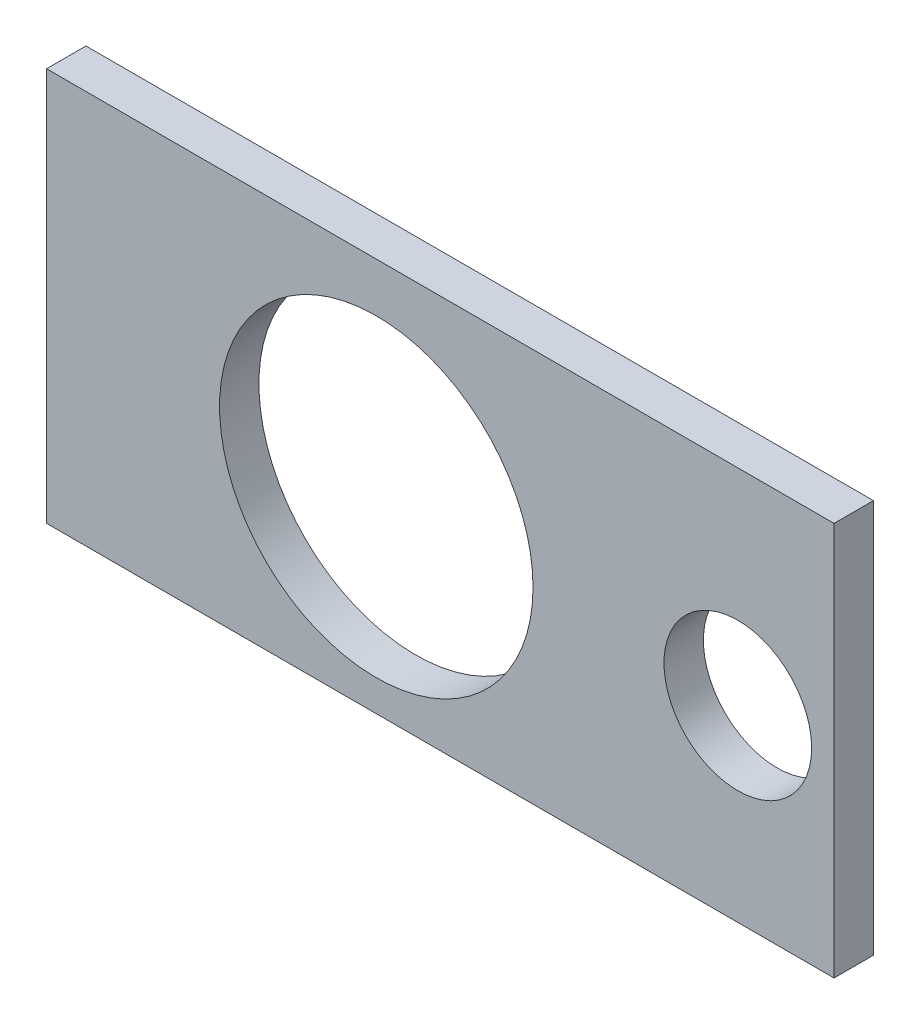
ISO-10303-21;
HEADER;
FILE_DESCRIPTION(('STEP AP214'),'2;1');
FILE_NAME('part.step','',(''),(''),'','','');
FILE_SCHEMA(('AUTOMOTIVE_DESIGN { 1 0 10303 214 1 1 1 1 }'));
ENDSEC;
DATA;
#1=APPLICATION_CONTEXT('core data for automotive mechanical design processes');
#2=APPLICATION_PROTOCOL_DEFINITION('international standard','automotive_design',2000,#1);
#3=PRODUCT_CONTEXT('',#1,'mechanical');
#4=PRODUCT('Part','Part','',(#3));
#5=PRODUCT_RELATED_PRODUCT_CATEGORY('part','',(#4));
#6=PRODUCT_DEFINITION_FORMATION('','',#4);
#7=PRODUCT_DEFINITION_CONTEXT('part definition',#1,'design');
#8=PRODUCT_DEFINITION('design','',#6,#7);
#9=PRODUCT_DEFINITION_SHAPE('','',#8);
#10=(LENGTH_UNIT() NAMED_UNIT(*) SI_UNIT(.MILLI.,.METRE.));
#11=(NAMED_UNIT(*) PLANE_ANGLE_UNIT() SI_UNIT($,.RADIAN.));
#12=(NAMED_UNIT(*) SI_UNIT($,.STERADIAN.) SOLID_ANGLE_UNIT());
#13=UNCERTAINTY_MEASURE_WITH_UNIT(LENGTH_MEASURE(1.E-05),#10,'distance_accuracy_value','');
#14=(GEOMETRIC_REPRESENTATION_CONTEXT(3) GLOBAL_UNCERTAINTY_ASSIGNED_CONTEXT((#13)) GLOBAL_UNIT_ASSIGNED_CONTEXT((#10,
#11,#12)) REPRESENTATION_CONTEXT('',''));
#15=CARTESIAN_POINT('',(0.,0.,0.));
#16=DIRECTION('',(0.,0.,1.));
#17=DIRECTION('',(1.,0.,0.));
#18=AXIS2_PLACEMENT_3D('',#15,#16,#17);
#19=CARTESIAN_POINT('',(19.7739413680782,0.,-2.54));
#20=DIRECTION('',(-1.,0.,0.));
#21=DIRECTION('',(0.,-1.,0.));
#22=AXIS2_PLACEMENT_3D('',#19,#20,#21);
#23=PLANE('',#22);
#24=DIRECTION('',(0.,-1.,0.));
#25=VECTOR('',#24,1.);
#26=CARTESIAN_POINT('',(19.7739413680782,0.,0.));
#27=LINE('',#26,#25);
#28=CARTESIAN_POINT('',(19.7739413680782,13.2791530944625,0.));
#29=VERTEX_POINT('',#28);
#30=CARTESIAN_POINT('',(19.7739413680782,-12.1208469055375,0.));
#31=VERTEX_POINT('',#30);
#32=EDGE_CURVE('E117',#29,#31,#27,.T.);
#33=ORIENTED_EDGE('',*,*,#32,.T.);
#34=DIRECTION('',(0.,0.,1.));
#35=VECTOR('',#34,1.);
#36=CARTESIAN_POINT('',(19.7739413680782,-12.1208469055375,-2.54));
#37=LINE('',#36,#35);
#38=CARTESIAN_POINT('',(19.7739413680782,-12.1208469055375,-2.54));
#39=VERTEX_POINT('',#38);
#40=EDGE_CURVE('E11',#39,#31,#37,.T.);
#41=ORIENTED_EDGE('',*,*,#40,.F.);
#42=DIRECTION('',(0.,-1.,0.));
#43=VECTOR('',#42,1.);
#44=CARTESIAN_POINT('',(19.7739413680782,0.,-2.54));
#45=LINE('',#44,#43);
#46=CARTESIAN_POINT('',(19.7739413680782,13.2791530944625,-2.54));
#47=VERTEX_POINT('',#46);
#48=EDGE_CURVE('E61',#47,#39,#45,.T.);
#49=ORIENTED_EDGE('',*,*,#48,.F.);
#50=DIRECTION('',(0.,0.,1.));
#51=VECTOR('',#50,1.);
#52=CARTESIAN_POINT('',(19.7739413680782,13.2791530944625,-2.54));
#53=LINE('',#52,#51);
#54=EDGE_CURVE('E45',#47,#29,#53,.T.);
#55=ORIENTED_EDGE('',*,*,#54,.T.);
#56=EDGE_LOOP('',(#33,#41,#49,#55));
#57=FACE_BOUND('',#56,.T.);
#58=ADVANCED_FACE('F41',(#57),#23,.F.);
#59=CARTESIAN_POINT('',(0.,-12.1208469055375,-2.54));
#60=DIRECTION('',(0.,-1.,0.));
#61=DIRECTION('',(0.,0.,-1.));
#62=AXIS2_PLACEMENT_3D('',#59,#60,#61);
#63=PLANE('',#62);
#64=DIRECTION('',(1.,0.,0.));
#65=VECTOR('',#64,1.);
#66=CARTESIAN_POINT('',(0.,-12.1208469055375,0.));
#67=LINE('',#66,#65);
#68=CARTESIAN_POINT('',(-31.0260586319218,-12.1208469055375,0.));
#69=VERTEX_POINT('',#68);
#70=EDGE_CURVE('E125',#69,#31,#67,.T.);
#71=ORIENTED_EDGE('',*,*,#70,.F.);
#72=DIRECTION('',(0.,0.,1.));
#73=VECTOR('',#72,1.);
#74=CARTESIAN_POINT('',(-31.0260586319218,-12.1208469055375,-2.54));
#75=LINE('',#74,#73);
#76=CARTESIAN_POINT('',(-31.0260586319218,-12.1208469055375,-2.54));
#77=VERTEX_POINT('',#76);
#78=EDGE_CURVE('E52',#77,#69,#75,.T.);
#79=ORIENTED_EDGE('',*,*,#78,.F.);
#80=DIRECTION('',(1.,0.,0.));
#81=VECTOR('',#80,1.);
#82=CARTESIAN_POINT('',(0.,-12.1208469055375,-2.54));
#83=LINE('',#82,#81);
#84=EDGE_CURVE('E102',#77,#39,#83,.T.);
#85=ORIENTED_EDGE('',*,*,#84,.T.);
#86=ORIENTED_EDGE('',*,*,#40,.T.);
#87=EDGE_LOOP('',(#71,#79,#85,#86));
#88=FACE_BOUND('',#87,.T.);
#89=ADVANCED_FACE('F136',(#88),#63,.T.);
#90=CARTESIAN_POINT('',(-31.0260586319218,0.,-2.54));
#91=DIRECTION('',(-1.,0.,0.));
#92=DIRECTION('',(0.,-1.,0.));
#93=AXIS2_PLACEMENT_3D('',#90,#91,#92);
#94=PLANE('',#93);
#95=DIRECTION('',(0.,-1.,0.));
#96=VECTOR('',#95,1.);
#97=CARTESIAN_POINT('',(-31.0260586319218,0.,0.));
#98=LINE('',#97,#96);
#99=CARTESIAN_POINT('',(-31.0260586319218,13.2791530944625,0.));
#100=VERTEX_POINT('',#99);
#101=EDGE_CURVE('E93',#100,#69,#98,.T.);
#102=ORIENTED_EDGE('',*,*,#101,.F.);
#103=DIRECTION('',(0.,0.,1.));
#104=VECTOR('',#103,1.);
#105=CARTESIAN_POINT('',(-31.0260586319218,13.2791530944625,-2.54));
#106=LINE('',#105,#104);
#107=CARTESIAN_POINT('',(-31.0260586319218,13.2791530944625,-2.54));
#108=VERTEX_POINT('',#107);
#109=EDGE_CURVE('E90',#108,#100,#106,.T.);
#110=ORIENTED_EDGE('',*,*,#109,.F.);
#111=DIRECTION('',(0.,-1.,0.));
#112=VECTOR('',#111,1.);
#113=CARTESIAN_POINT('',(-31.0260586319218,0.,-2.54));
#114=LINE('',#113,#112);
#115=EDGE_CURVE('E92',#108,#77,#114,.T.);
#116=ORIENTED_EDGE('',*,*,#115,.T.);
#117=ORIENTED_EDGE('',*,*,#78,.T.);
#118=EDGE_LOOP('',(#102,#110,#116,#117));
#119=FACE_BOUND('',#118,.T.);
#120=ADVANCED_FACE('F91',(#119),#94,.T.);
#121=CARTESIAN_POINT('',(13.5667618159935,0.,-2.54));
#122=DIRECTION('',(0.,0.,1.));
#123=DIRECTION('',(1.,0.,0.));
#124=AXIS2_PLACEMENT_3D('',#121,#122,#123);
#125=CYLINDRICAL_SURFACE('',#124,4.7625);
#126=CARTESIAN_POINT('',(13.5667618159935,0.,-2.54));
#127=DIRECTION('',(0.,0.,1.));
#128=DIRECTION('',(1.,0.,0.));
#129=AXIS2_PLACEMENT_3D('',#126,#127,#128);
#130=CIRCLE('',#129,4.7625);
#131=CARTESIAN_POINT('',(18.3292618159935,0.,-2.54));
#132=VERTEX_POINT('',#131);
#133=EDGE_CURVE('E159',#132,#132,#130,.T.);
#134=ORIENTED_EDGE('',*,*,#133,.F.);
#135=EDGE_LOOP('',(#134));
#136=FACE_BOUND('',#135,.T.);
#137=CARTESIAN_POINT('',(13.5667618159935,0.,0.));
#138=DIRECTION('',(0.,0.,1.));
#139=DIRECTION('',(1.,0.,0.));
#140=AXIS2_PLACEMENT_3D('',#137,#138,#139);
#141=CIRCLE('',#140,4.7625);
#142=CARTESIAN_POINT('',(18.3292618159935,0.,0.));
#143=VERTEX_POINT('',#142);
#144=EDGE_CURVE('E113',#143,#143,#141,.T.);
#145=ORIENTED_EDGE('',*,*,#144,.T.);
#146=EDGE_LOOP('',(#145));
#147=FACE_BOUND('',#146,.T.);
#148=ADVANCED_FACE('F143',(#136,#147),#125,.F.);
#149=CARTESIAN_POINT('',(-9.75581528954396,0.,-2.54));
#150=DIRECTION('',(0.,0.,1.));
#151=DIRECTION('',(1.,0.,0.));
#152=AXIS2_PLACEMENT_3D('',#149,#150,#151);
#153=CYLINDRICAL_SURFACE('',#152,10.1113487800163);
#154=CARTESIAN_POINT('',(-9.75581528954396,0.,-2.54));
#155=DIRECTION('',(0.,0.,1.));
#156=DIRECTION('',(1.,0.,0.));
#157=AXIS2_PLACEMENT_3D('',#154,#155,#156);
#158=CIRCLE('',#157,10.1113487800163);
#159=CARTESIAN_POINT('',(0.355533490472324,0.,-2.54));
#160=VERTEX_POINT('',#159);
#161=EDGE_CURVE('E128',#160,#160,#158,.T.);
#162=ORIENTED_EDGE('',*,*,#161,.F.);
#163=EDGE_LOOP('',(#162));
#164=FACE_BOUND('',#163,.T.);
#165=CARTESIAN_POINT('',(-9.75581528954396,0.,0.));
#166=DIRECTION('',(0.,0.,1.));
#167=DIRECTION('',(1.,0.,0.));
#168=AXIS2_PLACEMENT_3D('',#165,#166,#167);
#169=CIRCLE('',#168,10.1113487800163);
#170=CARTESIAN_POINT('',(0.355533490472324,0.,0.));
#171=VERTEX_POINT('',#170);
#172=EDGE_CURVE('E109',#171,#171,#169,.T.);
#173=ORIENTED_EDGE('',*,*,#172,.T.);
#174=EDGE_LOOP('',(#173));
#175=FACE_BOUND('',#174,.T.);
#176=ADVANCED_FACE('F43',(#164,#175),#153,.F.);
#177=CARTESIAN_POINT('',(0.,13.2791530944625,-2.54));
#178=DIRECTION('',(0.,-1.,0.));
#179=DIRECTION('',(0.,0.,-1.));
#180=AXIS2_PLACEMENT_3D('',#177,#178,#179);
#181=PLANE('',#180);
#182=DIRECTION('',(1.,0.,0.));
#183=VECTOR('',#182,1.);
#184=CARTESIAN_POINT('',(0.,13.2791530944625,0.));
#185=LINE('',#184,#183);
#186=EDGE_CURVE('E120',#100,#29,#185,.T.);
#187=ORIENTED_EDGE('',*,*,#186,.T.);
#188=ORIENTED_EDGE('',*,*,#54,.F.);
#189=DIRECTION('',(1.,0.,0.));
#190=VECTOR('',#189,1.);
#191=CARTESIAN_POINT('',(0.,13.2791530944625,-2.54));
#192=LINE('',#191,#190);
#193=EDGE_CURVE('E87',#108,#47,#192,.T.);
#194=ORIENTED_EDGE('',*,*,#193,.F.);
#195=ORIENTED_EDGE('',*,*,#109,.T.);
#196=EDGE_LOOP('',(#187,#188,#194,#195));
#197=FACE_BOUND('',#196,.T.);
#198=ADVANCED_FACE('F97',(#197),#181,.F.);
#199=CARTESIAN_POINT('',(0.,0.,-2.54));
#200=DIRECTION('',(0.,0.,1.));
#201=DIRECTION('',(1.,0.,0.));
#202=AXIS2_PLACEMENT_3D('',#199,#200,#201);
#203=PLANE('',#202);
#204=ORIENTED_EDGE('',*,*,#161,.T.);
#205=EDGE_LOOP('',(#204));
#206=FACE_BOUND('',#205,.T.);
#207=ORIENTED_EDGE('',*,*,#133,.T.);
#208=EDGE_LOOP('',(#207));
#209=FACE_BOUND('',#208,.T.);
#210=ORIENTED_EDGE('',*,*,#48,.T.);
#211=ORIENTED_EDGE('',*,*,#84,.F.);
#212=ORIENTED_EDGE('',*,*,#115,.F.);
#213=ORIENTED_EDGE('',*,*,#193,.T.);
#214=EDGE_LOOP('',(#210,#211,#212,#213));
#215=FACE_BOUND('',#214,.T.);
#216=ADVANCED_FACE('F101',(#206,#209,#215),#203,.F.);
#217=CARTESIAN_POINT('',(0.,0.,0.));
#218=DIRECTION('',(0.,0.,1.));
#219=DIRECTION('',(1.,0.,0.));
#220=AXIS2_PLACEMENT_3D('',#217,#218,#219);
#221=PLANE('',#220);
#222=ORIENTED_EDGE('',*,*,#172,.F.);
#223=EDGE_LOOP('',(#222));
#224=FACE_BOUND('',#223,.T.);
#225=ORIENTED_EDGE('',*,*,#144,.F.);
#226=EDGE_LOOP('',(#225));
#227=FACE_BOUND('',#226,.T.);
#228=ORIENTED_EDGE('',*,*,#32,.F.);
#229=ORIENTED_EDGE('',*,*,#186,.F.);
#230=ORIENTED_EDGE('',*,*,#101,.T.);
#231=ORIENTED_EDGE('',*,*,#70,.T.);
#232=EDGE_LOOP('',(#228,#229,#230,#231));
#233=FACE_BOUND('',#232,.T.);
#234=ADVANCED_FACE('F135',(#224,#227,#233),#221,.T.);
#235=CLOSED_SHELL('',(#58,#89,#120,#148,#176,#198,#216,#234));
#236=MANIFOLD_SOLID_BREP('B2',#235);
#237=ADVANCED_BREP_SHAPE_REPRESENTATION('',(#18,#236),#14);
#238=SHAPE_DEFINITION_REPRESENTATION(#9,#237);
ENDSEC;
END-ISO-10303-21;
